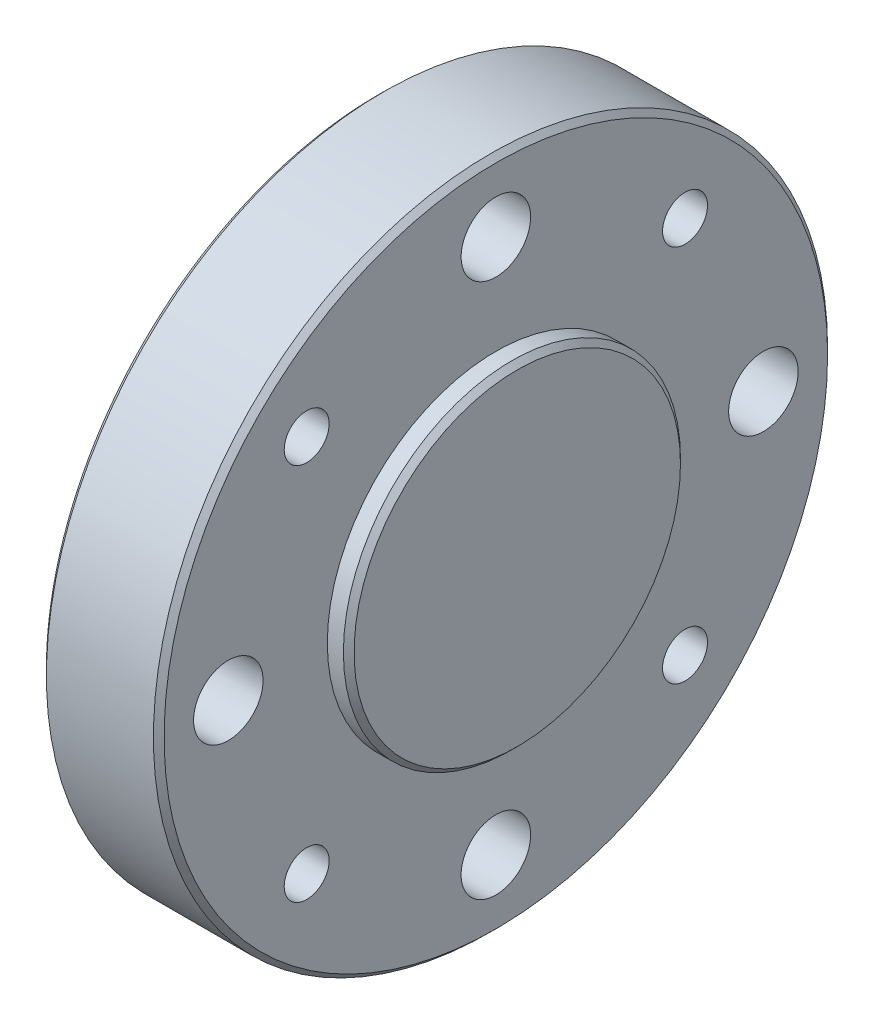
ISO-10303-21;
HEADER;
FILE_DESCRIPTION(('STEP AP214'),'2;1');
FILE_NAME('part.step','',(''),(''),'','','');
FILE_SCHEMA(('AUTOMOTIVE_DESIGN { 1 0 10303 214 1 1 1 1 }'));
ENDSEC;
DATA;
#1=APPLICATION_CONTEXT('core data for automotive mechanical design processes');
#2=APPLICATION_PROTOCOL_DEFINITION('international standard','automotive_design',2000,#1);
#3=PRODUCT_CONTEXT('',#1,'mechanical');
#4=PRODUCT('Part','Part','',(#3));
#5=PRODUCT_RELATED_PRODUCT_CATEGORY('part','',(#4));
#6=PRODUCT_DEFINITION_FORMATION('','',#4);
#7=PRODUCT_DEFINITION_CONTEXT('part definition',#1,'design');
#8=PRODUCT_DEFINITION('design','',#6,#7);
#9=PRODUCT_DEFINITION_SHAPE('','',#8);
#10=(LENGTH_UNIT() NAMED_UNIT(*) SI_UNIT(.MILLI.,.METRE.));
#11=(NAMED_UNIT(*) PLANE_ANGLE_UNIT() SI_UNIT($,.RADIAN.));
#12=(NAMED_UNIT(*) SI_UNIT($,.STERADIAN.) SOLID_ANGLE_UNIT());
#13=UNCERTAINTY_MEASURE_WITH_UNIT(LENGTH_MEASURE(1.E-05),#10,'distance_accuracy_value','');
#14=(GEOMETRIC_REPRESENTATION_CONTEXT(3) GLOBAL_UNCERTAINTY_ASSIGNED_CONTEXT((#13)) GLOBAL_UNIT_ASSIGNED_CONTEXT((#10,
#11,#12)) REPRESENTATION_CONTEXT('',''));
#15=CARTESIAN_POINT('',(0.,0.,0.));
#16=DIRECTION('',(0.,0.,1.));
#17=DIRECTION('',(1.,0.,0.));
#18=AXIS2_PLACEMENT_3D('',#15,#16,#17);
#19=CARTESIAN_POINT('',(0.,0.,0.));
#20=DIRECTION('',(1.,0.,0.));
#21=DIRECTION('',(0.,0.,-1.));
#22=AXIS2_PLACEMENT_3D('',#19,#20,#21);
#23=PLANE('',#22);
#24=CARTESIAN_POINT('',(0.,17.6776695296637,-17.6776695296637));
#25=DIRECTION('',(-1.,0.,0.));
#26=DIRECTION('',(0.,0.,1.));
#27=AXIS2_PLACEMENT_3D('',#24,#25,#26);
#28=CIRCLE('',#27,2.1);
#29=CARTESIAN_POINT('',(0.,17.6776695296637,-15.5776695296637));
#30=VERTEX_POINT('',#29);
#31=EDGE_CURVE('E456',#30,#30,#28,.T.);
#32=ORIENTED_EDGE('',*,*,#31,.F.);
#33=EDGE_LOOP('',(#32));
#34=FACE_BOUND('',#33,.T.);
#35=CARTESIAN_POINT('',(0.,17.6776695296637,17.6776695296637));
#36=DIRECTION('',(-1.,0.,0.));
#37=DIRECTION('',(0.,0.,1.));
#38=AXIS2_PLACEMENT_3D('',#35,#36,#37);
#39=CIRCLE('',#38,2.1);
#40=CARTESIAN_POINT('',(0.,17.6776695296637,19.7776695296637));
#41=VERTEX_POINT('',#40);
#42=EDGE_CURVE('E450',#41,#41,#39,.T.);
#43=ORIENTED_EDGE('',*,*,#42,.F.);
#44=EDGE_LOOP('',(#43));
#45=FACE_BOUND('',#44,.T.);
#46=CARTESIAN_POINT('',(0.,-17.6776695296637,-17.6776695296637));
#47=DIRECTION('',(-1.,0.,0.));
#48=DIRECTION('',(0.,0.,1.));
#49=AXIS2_PLACEMENT_3D('',#46,#47,#48);
#50=CIRCLE('',#49,2.1);
#51=CARTESIAN_POINT('',(0.,-17.6776695296637,-15.5776695296637));
#52=VERTEX_POINT('',#51);
#53=EDGE_CURVE('E444',#52,#52,#50,.T.);
#54=ORIENTED_EDGE('',*,*,#53,.F.);
#55=EDGE_LOOP('',(#54));
#56=FACE_BOUND('',#55,.T.);
#57=CARTESIAN_POINT('',(0.,0.,0.));
#58=DIRECTION('',(1.,0.,0.));
#59=DIRECTION('',(0.,0.,-1.));
#60=AXIS2_PLACEMENT_3D('',#57,#58,#59);
#61=CIRCLE('',#60,31.);
#62=CARTESIAN_POINT('',(0.,31.,0.));
#63=VERTEX_POINT('',#62);
#64=CARTESIAN_POINT('',(0.,1.08235921504137E-13,-31.));
#65=VERTEX_POINT('',#64);
#66=EDGE_CURVE('E79',#63,#65,#61,.F.);
#67=ORIENTED_EDGE('',*,*,#66,.T.);
#68=CARTESIAN_POINT('',(0.,0.,-25.));
#69=DIRECTION('',(-1.,0.,0.));
#70=DIRECTION('',(0.,-1.,0.));
#71=AXIS2_PLACEMENT_3D('',#68,#69,#70);
#72=CIRCLE('',#71,6.);
#73=EDGE_CURVE('E60',#65,#65,#72,.T.);
#74=ORIENTED_EDGE('',*,*,#73,.F.);
#75=CARTESIAN_POINT('',(0.,-31.,0.));
#76=VERTEX_POINT('',#75);
#77=EDGE_CURVE('E84',#65,#76,#61,.F.);
#78=ORIENTED_EDGE('',*,*,#77,.T.);
#79=CARTESIAN_POINT('',(0.,-25.,0.));
#80=DIRECTION('',(-1.,0.,0.));
#81=DIRECTION('',(0.,0.,1.));
#82=AXIS2_PLACEMENT_3D('',#79,#80,#81);
#83=CIRCLE('',#82,6.);
#84=EDGE_CURVE('E95',#76,#76,#83,.T.);
#85=ORIENTED_EDGE('',*,*,#84,.F.);
#86=CARTESIAN_POINT('',(0.,0.,0.));
#87=DIRECTION('',(1.,0.,0.));
#88=DIRECTION('',(0.,0.,-1.));
#89=AXIS2_PLACEMENT_3D('',#86,#87,#88);
#90=CIRCLE('',#89,31.);
#91=CARTESIAN_POINT('',(0.,-1.08235921504137E-13,31.));
#92=VERTEX_POINT('',#91);
#93=EDGE_CURVE('E78',#76,#92,#90,.F.);
#94=ORIENTED_EDGE('',*,*,#93,.T.);
#95=CARTESIAN_POINT('',(0.,0.,25.));
#96=DIRECTION('',(-1.,0.,0.));
#97=DIRECTION('',(0.,-1.,0.));
#98=AXIS2_PLACEMENT_3D('',#95,#96,#97);
#99=CIRCLE('',#98,6.);
#100=EDGE_CURVE('E55',#92,#92,#99,.T.);
#101=ORIENTED_EDGE('',*,*,#100,.F.);
#102=EDGE_CURVE('E69',#92,#63,#90,.F.);
#103=ORIENTED_EDGE('',*,*,#102,.T.);
#104=CARTESIAN_POINT('',(0.,25.,0.));
#105=DIRECTION('',(-1.,0.,0.));
#106=DIRECTION('',(0.,0.,1.));
#107=AXIS2_PLACEMENT_3D('',#104,#105,#106);
#108=CIRCLE('',#107,6.);
#109=EDGE_CURVE('E74',#63,#63,#108,.T.);
#110=ORIENTED_EDGE('',*,*,#109,.F.);
#111=EDGE_LOOP('',(#67,#74,#78,#85,#94,#101,#103,#110));
#112=FACE_BOUND('',#111,.T.);
#113=CARTESIAN_POINT('',(0.,-17.6776695296637,17.6776695296637));
#114=DIRECTION('',(-1.,0.,0.));
#115=DIRECTION('',(0.,0.,1.));
#116=AXIS2_PLACEMENT_3D('',#113,#114,#115);
#117=CIRCLE('',#116,2.1);
#118=CARTESIAN_POINT('',(0.,-17.6776695296637,19.7776695296637));
#119=VERTEX_POINT('',#118);
#120=EDGE_CURVE('E438',#119,#119,#117,.T.);
#121=ORIENTED_EDGE('',*,*,#120,.F.);
#122=EDGE_LOOP('',(#121));
#123=FACE_BOUND('',#122,.T.);
#124=ADVANCED_FACE('F39',(#34,#45,#56,#112,#123),#23,.F.);
#125=CARTESIAN_POINT('',(13.,0.,25.));
#126=DIRECTION('',(-1.,0.,0.));
#127=DIRECTION('',(0.,0.,1.));
#128=AXIS2_PLACEMENT_3D('',#125,#126,#127);
#129=CYLINDRICAL_SURFACE('',#128,3.25);
#130=CARTESIAN_POINT('',(11.,0.,25.));
#131=DIRECTION('',(1.,0.,0.));
#132=DIRECTION('',(0.,0.,-1.));
#133=AXIS2_PLACEMENT_3D('',#130,#131,#132);
#134=CIRCLE('',#133,3.25);
#135=CARTESIAN_POINT('',(11.,0.,28.25));
#136=VERTEX_POINT('',#135);
#137=EDGE_CURVE('E130',#136,#136,#134,.T.);
#138=CARTESIAN_POINT('',(5.,0.,25.));
#139=DIRECTION('',(-1.,0.,0.));
#140=DIRECTION('',(0.,0.,1.));
#141=AXIS2_PLACEMENT_3D('',#138,#139,#140);
#142=CIRCLE('',#141,3.25);
#143=CARTESIAN_POINT('',(5.,0.,28.25));
#144=VERTEX_POINT('',#143);
#145=EDGE_CURVE('E44',#144,#144,#142,.F.);
#146=CARTESIAN_POINT('',(11.,0.,28.25));
#147=CARTESIAN_POINT('',(10.9375,0.,28.25));
#148=CARTESIAN_POINT('',(10.875,0.,28.25));
#149=CARTESIAN_POINT('',(10.75,0.,28.25));
#150=CARTESIAN_POINT('',(10.6875,0.,28.25));
#151=CARTESIAN_POINT('',(10.5625,0.,28.25));
#152=CARTESIAN_POINT('',(10.5,0.,28.25));
#153=CARTESIAN_POINT('',(10.375,0.,28.25));
#154=CARTESIAN_POINT('',(10.3125,0.,28.25));
#155=CARTESIAN_POINT('',(10.1875,0.,28.25));
#156=CARTESIAN_POINT('',(10.125,0.,28.25));
#157=CARTESIAN_POINT('',(10.,0.,28.25));
#158=CARTESIAN_POINT('',(9.9375,0.,28.25));
#159=CARTESIAN_POINT('',(9.8125,0.,28.25));
#160=CARTESIAN_POINT('',(9.75,0.,28.25));
#161=CARTESIAN_POINT('',(9.625,0.,28.25));
#162=CARTESIAN_POINT('',(9.5625,0.,28.25));
#163=CARTESIAN_POINT('',(9.4375,0.,28.25));
#164=CARTESIAN_POINT('',(9.375,0.,28.25));
#165=CARTESIAN_POINT('',(9.25,0.,28.25));
#166=CARTESIAN_POINT('',(9.1875,0.,28.25));
#167=CARTESIAN_POINT('',(9.0625,0.,28.25));
#168=CARTESIAN_POINT('',(9.,0.,28.25));
#169=CARTESIAN_POINT('',(8.875,0.,28.25));
#170=CARTESIAN_POINT('',(8.8125,0.,28.25));
#171=CARTESIAN_POINT('',(8.6875,0.,28.25));
#172=CARTESIAN_POINT('',(8.625,0.,28.25));
#173=CARTESIAN_POINT('',(8.5,0.,28.25));
#174=CARTESIAN_POINT('',(8.4375,0.,28.25));
#175=CARTESIAN_POINT('',(8.3125,0.,28.25));
#176=CARTESIAN_POINT('',(8.25,0.,28.25));
#177=CARTESIAN_POINT('',(8.125,0.,28.25));
#178=CARTESIAN_POINT('',(8.0625,0.,28.25));
#179=CARTESIAN_POINT('',(7.9375,0.,28.25));
#180=CARTESIAN_POINT('',(7.875,0.,28.25));
#181=CARTESIAN_POINT('',(7.75,0.,28.25));
#182=CARTESIAN_POINT('',(7.6875,0.,28.25));
#183=CARTESIAN_POINT('',(7.5625,0.,28.25));
#184=CARTESIAN_POINT('',(7.5,0.,28.25));
#185=CARTESIAN_POINT('',(7.375,0.,28.25));
#186=CARTESIAN_POINT('',(7.3125,0.,28.25));
#187=CARTESIAN_POINT('',(7.1875,0.,28.25));
#188=CARTESIAN_POINT('',(7.125,0.,28.25));
#189=CARTESIAN_POINT('',(7.,0.,28.25));
#190=CARTESIAN_POINT('',(6.9375,0.,28.25));
#191=CARTESIAN_POINT('',(6.8125,0.,28.25));
#192=CARTESIAN_POINT('',(6.75,0.,28.25));
#193=CARTESIAN_POINT('',(6.625,0.,28.25));
#194=CARTESIAN_POINT('',(6.5625,0.,28.25));
#195=CARTESIAN_POINT('',(6.4375,0.,28.25));
#196=CARTESIAN_POINT('',(6.375,0.,28.25));
#197=CARTESIAN_POINT('',(6.25,0.,28.25));
#198=CARTESIAN_POINT('',(6.1875,0.,28.25));
#199=CARTESIAN_POINT('',(6.0625,0.,28.25));
#200=CARTESIAN_POINT('',(6.,0.,28.25));
#201=CARTESIAN_POINT('',(5.875,0.,28.25));
#202=CARTESIAN_POINT('',(5.8125,0.,28.25));
#203=CARTESIAN_POINT('',(5.6875,0.,28.25));
#204=CARTESIAN_POINT('',(5.625,0.,28.25));
#205=CARTESIAN_POINT('',(5.5,0.,28.25));
#206=CARTESIAN_POINT('',(5.4375,0.,28.25));
#207=CARTESIAN_POINT('',(5.3125,0.,28.25));
#208=CARTESIAN_POINT('',(5.25,0.,28.25));
#209=CARTESIAN_POINT('',(5.125,0.,28.25));
#210=CARTESIAN_POINT('',(5.0625,0.,28.25));
#211=CARTESIAN_POINT('',(5.,0.,28.25));
#212=B_SPLINE_CURVE_WITH_KNOTS('',3,(#146,#147,#148,#149,#150,#151,#152,#153,#154,#155,#156,
#157,#158,#159,#160,#161,#162,#163,#164,#165,#166,#167,#168,#169,#170,#171,#172,#173,#174,#175,
#176,#177,#178,#179,#180,#181,#182,#183,#184,#185,#186,#187,#188,#189,#190,#191,#192,#193,#194,
#195,#196,#197,#198,#199,#200,#201,#202,#203,#204,#205,#206,#207,#208,#209,#210,#211),
.UNSPECIFIED.,.F.,.F.,(4,2,2,2,2,2,2,2,2,2,2,2,2,2,2,2,2,2,2,2,2,2,2,2,2,2,2,2,2,2,2,2,4),(0.,
0.1875,0.374999999999999,0.562499999999999,0.749999999999999,0.937499999999999,1.125,1.3125,1.5,
1.6875,1.875,2.0625,2.25,2.4375,2.625,2.8125,3.,3.1875,3.375,3.5625,3.75,3.9375,4.125,4.3125,
4.5,4.6875,4.875,5.0625,5.25,5.4375,5.625,5.8125,6.),.UNSPECIFIED.);
#213=EDGE_CURVE('BSEAM184',#136,#144,#212,.T.);
#214=ORIENTED_EDGE('',*,*,#137,.T.);
#215=ORIENTED_EDGE('',*,*,#145,.F.);
#216=ORIENTED_EDGE('',*,*,#213,.T.);
#217=ORIENTED_EDGE('',*,*,#213,.F.);
#218=EDGE_LOOP('',(#214,#216,#215,#217));
#219=FACE_BOUND('',#218,.T.);
#220=ADVANCED_FACE('F184',(#219),#129,.F.);
#221=CARTESIAN_POINT('',(13.,0.,-25.));
#222=DIRECTION('',(-1.,0.,0.));
#223=DIRECTION('',(0.,0.,1.));
#224=AXIS2_PLACEMENT_3D('',#221,#222,#223);
#225=CYLINDRICAL_SURFACE('',#224,3.25);
#226=CARTESIAN_POINT('',(11.,0.,-25.));
#227=DIRECTION('',(1.,0.,0.));
#228=DIRECTION('',(0.,0.,-1.));
#229=AXIS2_PLACEMENT_3D('',#226,#227,#228);
#230=CIRCLE('',#229,3.25);
#231=CARTESIAN_POINT('',(11.,0.,-21.75));
#232=VERTEX_POINT('',#231);
#233=EDGE_CURVE('E101',#232,#232,#230,.T.);
#234=CARTESIAN_POINT('',(5.,0.,-25.));
#235=DIRECTION('',(-1.,0.,0.));
#236=DIRECTION('',(0.,0.,1.));
#237=AXIS2_PLACEMENT_3D('',#234,#235,#236);
#238=CIRCLE('',#237,3.25);
#239=CARTESIAN_POINT('',(5.,0.,-21.75));
#240=VERTEX_POINT('',#239);
#241=EDGE_CURVE('E124',#240,#240,#238,.F.);
#242=CARTESIAN_POINT('',(11.,0.,-21.75));
#243=CARTESIAN_POINT('',(10.9375,0.,-21.75));
#244=CARTESIAN_POINT('',(10.875,0.,-21.75));
#245=CARTESIAN_POINT('',(10.75,0.,-21.75));
#246=CARTESIAN_POINT('',(10.6875,0.,-21.75));
#247=CARTESIAN_POINT('',(10.5625,0.,-21.75));
#248=CARTESIAN_POINT('',(10.5,0.,-21.75));
#249=CARTESIAN_POINT('',(10.375,0.,-21.75));
#250=CARTESIAN_POINT('',(10.3125,0.,-21.75));
#251=CARTESIAN_POINT('',(10.1875,0.,-21.75));
#252=CARTESIAN_POINT('',(10.125,0.,-21.75));
#253=CARTESIAN_POINT('',(10.,0.,-21.75));
#254=CARTESIAN_POINT('',(9.9375,0.,-21.75));
#255=CARTESIAN_POINT('',(9.8125,0.,-21.75));
#256=CARTESIAN_POINT('',(9.75,0.,-21.75));
#257=CARTESIAN_POINT('',(9.625,0.,-21.75));
#258=CARTESIAN_POINT('',(9.5625,0.,-21.75));
#259=CARTESIAN_POINT('',(9.4375,0.,-21.75));
#260=CARTESIAN_POINT('',(9.375,0.,-21.75));
#261=CARTESIAN_POINT('',(9.25,0.,-21.75));
#262=CARTESIAN_POINT('',(9.1875,0.,-21.75));
#263=CARTESIAN_POINT('',(9.0625,0.,-21.75));
#264=CARTESIAN_POINT('',(9.,0.,-21.75));
#265=CARTESIAN_POINT('',(8.875,0.,-21.75));
#266=CARTESIAN_POINT('',(8.8125,0.,-21.75));
#267=CARTESIAN_POINT('',(8.6875,0.,-21.75));
#268=CARTESIAN_POINT('',(8.625,0.,-21.75));
#269=CARTESIAN_POINT('',(8.5,0.,-21.75));
#270=CARTESIAN_POINT('',(8.4375,0.,-21.75));
#271=CARTESIAN_POINT('',(8.3125,0.,-21.75));
#272=CARTESIAN_POINT('',(8.25,0.,-21.75));
#273=CARTESIAN_POINT('',(8.125,0.,-21.75));
#274=CARTESIAN_POINT('',(8.0625,0.,-21.75));
#275=CARTESIAN_POINT('',(7.9375,0.,-21.75));
#276=CARTESIAN_POINT('',(7.875,0.,-21.75));
#277=CARTESIAN_POINT('',(7.75,0.,-21.75));
#278=CARTESIAN_POINT('',(7.6875,0.,-21.75));
#279=CARTESIAN_POINT('',(7.5625,0.,-21.75));
#280=CARTESIAN_POINT('',(7.5,0.,-21.75));
#281=CARTESIAN_POINT('',(7.375,0.,-21.75));
#282=CARTESIAN_POINT('',(7.3125,0.,-21.75));
#283=CARTESIAN_POINT('',(7.1875,0.,-21.75));
#284=CARTESIAN_POINT('',(7.125,0.,-21.75));
#285=CARTESIAN_POINT('',(7.,0.,-21.75));
#286=CARTESIAN_POINT('',(6.9375,0.,-21.75));
#287=CARTESIAN_POINT('',(6.8125,0.,-21.75));
#288=CARTESIAN_POINT('',(6.75,0.,-21.75));
#289=CARTESIAN_POINT('',(6.625,0.,-21.75));
#290=CARTESIAN_POINT('',(6.5625,0.,-21.75));
#291=CARTESIAN_POINT('',(6.4375,0.,-21.75));
#292=CARTESIAN_POINT('',(6.375,0.,-21.75));
#293=CARTESIAN_POINT('',(6.25,0.,-21.75));
#294=CARTESIAN_POINT('',(6.1875,0.,-21.75));
#295=CARTESIAN_POINT('',(6.0625,0.,-21.75));
#296=CARTESIAN_POINT('',(6.,0.,-21.75));
#297=CARTESIAN_POINT('',(5.875,0.,-21.75));
#298=CARTESIAN_POINT('',(5.8125,0.,-21.75));
#299=CARTESIAN_POINT('',(5.6875,0.,-21.75));
#300=CARTESIAN_POINT('',(5.625,0.,-21.75));
#301=CARTESIAN_POINT('',(5.5,0.,-21.75));
#302=CARTESIAN_POINT('',(5.4375,0.,-21.75));
#303=CARTESIAN_POINT('',(5.3125,0.,-21.75));
#304=CARTESIAN_POINT('',(5.25,0.,-21.75));
#305=CARTESIAN_POINT('',(5.125,0.,-21.75));
#306=CARTESIAN_POINT('',(5.0625,0.,-21.75));
#307=CARTESIAN_POINT('',(5.,0.,-21.75));
#308=B_SPLINE_CURVE_WITH_KNOTS('',3,(#242,#243,#244,#245,#246,#247,#248,#249,#250,#251,#252,
#253,#254,#255,#256,#257,#258,#259,#260,#261,#262,#263,#264,#265,#266,#267,#268,#269,#270,#271,
#272,#273,#274,#275,#276,#277,#278,#279,#280,#281,#282,#283,#284,#285,#286,#287,#288,#289,#290,
#291,#292,#293,#294,#295,#296,#297,#298,#299,#300,#301,#302,#303,#304,#305,#306,#307),
.UNSPECIFIED.,.F.,.F.,(4,2,2,2,2,2,2,2,2,2,2,2,2,2,2,2,2,2,2,2,2,2,2,2,2,2,2,2,2,2,2,2,4),(0.,
0.1875,0.374999999999999,0.562499999999999,0.749999999999999,0.937499999999999,1.125,1.3125,1.5,
1.6875,1.875,2.0625,2.25,2.4375,2.625,2.8125,3.,3.1875,3.375,3.5625,3.75,3.9375,4.125,4.3125,
4.5,4.6875,4.875,5.0625,5.25,5.4375,5.625,5.8125,6.),.UNSPECIFIED.);
#309=EDGE_CURVE('BSEAM165',#232,#240,#308,.T.);
#310=ORIENTED_EDGE('',*,*,#233,.T.);
#311=ORIENTED_EDGE('',*,*,#241,.F.);
#312=ORIENTED_EDGE('',*,*,#309,.T.);
#313=ORIENTED_EDGE('',*,*,#309,.F.);
#314=EDGE_LOOP('',(#310,#312,#311,#313));
#315=FACE_BOUND('',#314,.T.);
#316=ADVANCED_FACE('F165',(#315),#225,.F.);
#317=CARTESIAN_POINT('',(11.,-25.,0.));
#318=DIRECTION('',(-1.,0.,0.));
#319=DIRECTION('',(0.,0.,1.));
#320=AXIS2_PLACEMENT_3D('',#317,#318,#319);
#321=CYLINDRICAL_SURFACE('',#320,3.25);
#322=CARTESIAN_POINT('',(11.,-25.,0.));
#323=DIRECTION('',(-1.,0.,0.));
#324=DIRECTION('',(0.,0.,1.));
#325=AXIS2_PLACEMENT_3D('',#322,#323,#324);
#326=CIRCLE('',#325,3.25);
#327=CARTESIAN_POINT('',(11.,-25.,3.25));
#328=VERTEX_POINT('',#327);
#329=EDGE_CURVE('E106',#328,#328,#326,.T.);
#330=ORIENTED_EDGE('',*,*,#329,.F.);
#331=EDGE_LOOP('',(#330));
#332=FACE_BOUND('',#331,.T.);
#333=CARTESIAN_POINT('',(5.,-25.,0.));
#334=DIRECTION('',(-1.,0.,0.));
#335=DIRECTION('',(0.,0.,1.));
#336=AXIS2_PLACEMENT_3D('',#333,#334,#335);
#337=CIRCLE('',#336,3.25);
#338=CARTESIAN_POINT('',(5.,-25.,3.25));
#339=VERTEX_POINT('',#338);
#340=EDGE_CURVE('E109',#339,#339,#337,.F.);
#341=ORIENTED_EDGE('',*,*,#340,.F.);
#342=EDGE_LOOP('',(#341));
#343=FACE_BOUND('',#342,.T.);
#344=ADVANCED_FACE('F161',(#332,#343),#321,.F.);
#345=CARTESIAN_POINT('',(11.,25.,0.));
#346=DIRECTION('',(-1.,0.,0.));
#347=DIRECTION('',(0.,0.,1.));
#348=AXIS2_PLACEMENT_3D('',#345,#346,#347);
#349=CYLINDRICAL_SURFACE('',#348,3.25);
#350=CARTESIAN_POINT('',(11.,25.,0.));
#351=DIRECTION('',(-1.,0.,0.));
#352=DIRECTION('',(0.,0.,1.));
#353=AXIS2_PLACEMENT_3D('',#350,#351,#352);
#354=CIRCLE('',#353,3.25);
#355=CARTESIAN_POINT('',(11.,25.,3.25));
#356=VERTEX_POINT('',#355);
#357=EDGE_CURVE('E102',#356,#356,#354,.T.);
#358=ORIENTED_EDGE('',*,*,#357,.F.);
#359=EDGE_LOOP('',(#358));
#360=FACE_BOUND('',#359,.T.);
#361=CARTESIAN_POINT('',(5.,25.,0.));
#362=DIRECTION('',(-1.,0.,0.));
#363=DIRECTION('',(0.,0.,1.));
#364=AXIS2_PLACEMENT_3D('',#361,#362,#363);
#365=CIRCLE('',#364,3.25);
#366=CARTESIAN_POINT('',(5.,25.,3.25));
#367=VERTEX_POINT('',#366);
#368=EDGE_CURVE('E92',#367,#367,#365,.F.);
#369=ORIENTED_EDGE('',*,*,#368,.F.);
#370=EDGE_LOOP('',(#369));
#371=FACE_BOUND('',#370,.T.);
#372=ADVANCED_FACE('F164',(#360,#371),#349,.F.);
#373=CARTESIAN_POINT('',(11.,0.,0.));
#374=DIRECTION('',(-1.,0.,0.));
#375=DIRECTION('',(0.,0.,1.));
#376=AXIS2_PLACEMENT_3D('',#373,#374,#375);
#377=CYLINDRICAL_SURFACE('',#376,31.5);
#378=CARTESIAN_POINT('',(10.5,0.,0.));
#379=DIRECTION('',(1.,0.,0.));
#380=DIRECTION('',(0.,0.,-1.));
#381=AXIS2_PLACEMENT_3D('',#378,#379,#380);
#382=CIRCLE('',#381,31.5);
#383=CARTESIAN_POINT('',(10.5,0.,-31.5));
#384=VERTEX_POINT('',#383);
#385=EDGE_CURVE('E119',#384,#384,#382,.F.);
#386=ORIENTED_EDGE('',*,*,#385,.T.);
#387=EDGE_LOOP('',(#386));
#388=FACE_BOUND('',#387,.T.);
#389=CARTESIAN_POINT('',(0.499999999999994,0.,0.));
#390=DIRECTION('',(1.,0.,0.));
#391=DIRECTION('',(0.,0.,-1.));
#392=AXIS2_PLACEMENT_3D('',#389,#390,#391);
#393=CIRCLE('',#392,31.5);
#394=CARTESIAN_POINT('',(0.499999999999994,0.,-31.5));
#395=VERTEX_POINT('',#394);
#396=EDGE_CURVE('E116',#395,#395,#393,.T.);
#397=ORIENTED_EDGE('',*,*,#396,.T.);
#398=EDGE_LOOP('',(#397));
#399=FACE_BOUND('',#398,.T.);
#400=ADVANCED_FACE('F152',(#388,#399),#377,.T.);
#401=CARTESIAN_POINT('',(11.,0.,0.));
#402=DIRECTION('',(1.,0.,0.));
#403=DIRECTION('',(0.,0.,-1.));
#404=AXIS2_PLACEMENT_3D('',#401,#402,#403);
#405=PLANE('',#404);
#406=CARTESIAN_POINT('',(11.,17.6776695296637,-17.6776695296637));
#407=DIRECTION('',(1.,0.,0.));
#408=DIRECTION('',(0.,0.,-1.));
#409=AXIS2_PLACEMENT_3D('',#406,#407,#408);
#410=CIRCLE('',#409,2.1);
#411=CARTESIAN_POINT('',(11.,17.6776695296637,-19.7776695296637));
#412=VERTEX_POINT('',#411);
#413=EDGE_CURVE('E453',#412,#412,#410,.T.);
#414=ORIENTED_EDGE('',*,*,#413,.F.);
#415=EDGE_LOOP('',(#414));
#416=FACE_BOUND('',#415,.T.);
#417=CARTESIAN_POINT('',(11.,17.6776695296637,17.6776695296637));
#418=DIRECTION('',(1.,0.,0.));
#419=DIRECTION('',(0.,0.,-1.));
#420=AXIS2_PLACEMENT_3D('',#417,#418,#419);
#421=CIRCLE('',#420,2.1);
#422=CARTESIAN_POINT('',(11.,17.6776695296637,15.5776695296637));
#423=VERTEX_POINT('',#422);
#424=EDGE_CURVE('E447',#423,#423,#421,.T.);
#425=ORIENTED_EDGE('',*,*,#424,.F.);
#426=EDGE_LOOP('',(#425));
#427=FACE_BOUND('',#426,.T.);
#428=CARTESIAN_POINT('',(11.,-17.6776695296637,-17.6776695296637));
#429=DIRECTION('',(1.,0.,0.));
#430=DIRECTION('',(0.,0.,-1.));
#431=AXIS2_PLACEMENT_3D('',#428,#429,#430);
#432=CIRCLE('',#431,2.1);
#433=CARTESIAN_POINT('',(11.,-17.6776695296637,-19.7776695296637));
#434=VERTEX_POINT('',#433);
#435=EDGE_CURVE('E441',#434,#434,#432,.T.);
#436=ORIENTED_EDGE('',*,*,#435,.F.);
#437=EDGE_LOOP('',(#436));
#438=FACE_BOUND('',#437,.T.);
#439=CARTESIAN_POINT('',(11.,-17.6776695296637,17.6776695296637));
#440=DIRECTION('',(1.,0.,0.));
#441=DIRECTION('',(0.,0.,-1.));
#442=AXIS2_PLACEMENT_3D('',#439,#440,#441);
#443=CIRCLE('',#442,2.1);
#444=CARTESIAN_POINT('',(11.,-17.6776695296637,15.5776695296637));
#445=VERTEX_POINT('',#444);
#446=EDGE_CURVE('E434',#445,#445,#443,.T.);
#447=ORIENTED_EDGE('',*,*,#446,.F.);
#448=EDGE_LOOP('',(#447));
#449=FACE_BOUND('',#448,.T.);
#450=ORIENTED_EDGE('',*,*,#233,.F.);
#451=EDGE_LOOP('',(#450));
#452=FACE_BOUND('',#451,.T.);
#453=ORIENTED_EDGE('',*,*,#137,.F.);
#454=EDGE_LOOP('',(#453));
#455=FACE_BOUND('',#454,.T.);
#456=CARTESIAN_POINT('',(11.,0.,0.));
#457=DIRECTION('',(1.,0.,0.));
#458=DIRECTION('',(0.,0.,-1.));
#459=AXIS2_PLACEMENT_3D('',#456,#457,#458);
#460=CIRCLE('',#459,15.75);
#461=CARTESIAN_POINT('',(11.,0.,-15.75));
#462=VERTEX_POINT('',#461);
#463=EDGE_CURVE('E122',#462,#462,#460,.T.);
#464=ORIENTED_EDGE('',*,*,#463,.F.);
#465=EDGE_LOOP('',(#464));
#466=FACE_BOUND('',#465,.T.);
#467=CARTESIAN_POINT('',(11.,0.,0.));
#468=DIRECTION('',(1.,0.,0.));
#469=DIRECTION('',(0.,0.,-1.));
#470=AXIS2_PLACEMENT_3D('',#467,#468,#469);
#471=CIRCLE('',#470,31.);
#472=CARTESIAN_POINT('',(11.,0.,-31.));
#473=VERTEX_POINT('',#472);
#474=EDGE_CURVE('E105',#473,#473,#471,.T.);
#475=ORIENTED_EDGE('',*,*,#474,.T.);
#476=EDGE_LOOP('',(#475));
#477=FACE_BOUND('',#476,.T.);
#478=ORIENTED_EDGE('',*,*,#357,.T.);
#479=EDGE_LOOP('',(#478));
#480=FACE_BOUND('',#479,.T.);
#481=ORIENTED_EDGE('',*,*,#329,.T.);
#482=EDGE_LOOP('',(#481));
#483=FACE_BOUND('',#482,.T.);
#484=ADVANCED_FACE('F148',(#416,#427,#438,#449,#452,#455,#466,#477,#480,#483),#405,.T.);
#485=CARTESIAN_POINT('',(5.,25.,0.));
#486=DIRECTION('',(-1.,0.,0.));
#487=DIRECTION('',(0.,0.,1.));
#488=AXIS2_PLACEMENT_3D('',#485,#486,#487);
#489=PLANE('',#488);
#490=CARTESIAN_POINT('',(5.,25.,0.));
#491=DIRECTION('',(-1.,0.,0.));
#492=DIRECTION('',(0.,0.,1.));
#493=AXIS2_PLACEMENT_3D('',#490,#491,#492);
#494=CIRCLE('',#493,6.);
#495=CARTESIAN_POINT('',(5.,25.,6.));
#496=VERTEX_POINT('',#495);
#497=EDGE_CURVE('E88',#496,#496,#494,.T.);
#498=ORIENTED_EDGE('',*,*,#497,.T.);
#499=EDGE_LOOP('',(#498));
#500=FACE_BOUND('',#499,.T.);
#501=ORIENTED_EDGE('',*,*,#368,.T.);
#502=EDGE_LOOP('',(#501));
#503=FACE_BOUND('',#502,.T.);
#504=ADVANCED_FACE('F151',(#500,#503),#489,.T.);
#505=CARTESIAN_POINT('',(5.,25.,0.));
#506=DIRECTION('',(-1.,0.,0.));
#507=DIRECTION('',(0.,0.,1.));
#508=AXIS2_PLACEMENT_3D('',#505,#506,#507);
#509=CYLINDRICAL_SURFACE('',#508,6.);
#510=ORIENTED_EDGE('',*,*,#497,.F.);
#511=EDGE_LOOP('',(#510));
#512=FACE_BOUND('',#511,.T.);
#513=ORIENTED_EDGE('',*,*,#109,.T.);
#514=EDGE_LOOP('',(#513));
#515=FACE_BOUND('',#514,.T.);
#516=ADVANCED_FACE('F87',(#512,#515),#509,.F.);
#517=CARTESIAN_POINT('',(5.,-25.,0.));
#518=DIRECTION('',(-1.,0.,0.));
#519=DIRECTION('',(0.,0.,1.));
#520=AXIS2_PLACEMENT_3D('',#517,#518,#519);
#521=PLANE('',#520);
#522=CARTESIAN_POINT('',(5.,-25.,0.));
#523=DIRECTION('',(-1.,0.,0.));
#524=DIRECTION('',(0.,0.,1.));
#525=AXIS2_PLACEMENT_3D('',#522,#523,#524);
#526=CIRCLE('',#525,6.);
#527=CARTESIAN_POINT('',(5.,-25.,6.));
#528=VERTEX_POINT('',#527);
#529=EDGE_CURVE('E89',#528,#528,#526,.T.);
#530=ORIENTED_EDGE('',*,*,#529,.T.);
#531=EDGE_LOOP('',(#530));
#532=FACE_BOUND('',#531,.T.);
#533=ORIENTED_EDGE('',*,*,#340,.T.);
#534=EDGE_LOOP('',(#533));
#535=FACE_BOUND('',#534,.T.);
#536=ADVANCED_FACE('F169',(#532,#535),#521,.T.);
#537=CARTESIAN_POINT('',(5.,-25.,0.));
#538=DIRECTION('',(-1.,0.,0.));
#539=DIRECTION('',(0.,0.,1.));
#540=AXIS2_PLACEMENT_3D('',#537,#538,#539);
#541=CYLINDRICAL_SURFACE('',#540,6.);
#542=ORIENTED_EDGE('',*,*,#529,.F.);
#543=EDGE_LOOP('',(#542));
#544=FACE_BOUND('',#543,.T.);
#545=ORIENTED_EDGE('',*,*,#84,.T.);
#546=EDGE_LOOP('',(#545));
#547=FACE_BOUND('',#546,.T.);
#548=ADVANCED_FACE('F171',(#544,#547),#541,.F.);
#549=CARTESIAN_POINT('',(11.,0.,0.));
#550=DIRECTION('',(-1.,0.,0.));
#551=DIRECTION('',(0.,0.,1.));
#552=AXIS2_PLACEMENT_3D('',#549,#550,#551);
#553=CONICAL_SURFACE('',#552,31.,0.785398163397448);
#554=ORIENTED_EDGE('',*,*,#385,.F.);
#555=EDGE_LOOP('',(#554));
#556=FACE_BOUND('',#555,.T.);
#557=ORIENTED_EDGE('',*,*,#474,.F.);
#558=EDGE_LOOP('',(#557));
#559=FACE_BOUND('',#558,.T.);
#560=ADVANCED_FACE('F178',(#556,#559),#553,.T.);
#561=CARTESIAN_POINT('',(0.499999999999994,0.,0.));
#562=DIRECTION('',(1.,0.,0.));
#563=DIRECTION('',(0.,0.,-1.));
#564=AXIS2_PLACEMENT_3D('',#561,#562,#563);
#565=CONICAL_SURFACE('',#564,31.5,0.785398163397448);
#566=ORIENTED_EDGE('',*,*,#66,.F.);
#567=ORIENTED_EDGE('',*,*,#102,.F.);
#568=ORIENTED_EDGE('',*,*,#93,.F.);
#569=ORIENTED_EDGE('',*,*,#77,.F.);
#570=EDGE_LOOP('',(#566,#567,#568,#569));
#571=FACE_BOUND('',#570,.T.);
#572=ORIENTED_EDGE('',*,*,#396,.F.);
#573=EDGE_LOOP('',(#572));
#574=FACE_BOUND('',#573,.T.);
#575=ADVANCED_FACE('F82',(#571,#574),#565,.T.);
#576=CARTESIAN_POINT('',(13.,0.,0.));
#577=DIRECTION('',(-1.,0.,0.));
#578=DIRECTION('',(0.,0.,1.));
#579=AXIS2_PLACEMENT_3D('',#576,#577,#578);
#580=CYLINDRICAL_SURFACE('',#579,15.75);
#581=CARTESIAN_POINT('',(12.5,0.,0.));
#582=DIRECTION('',(1.,0.,0.));
#583=DIRECTION('',(0.,0.,-1.));
#584=AXIS2_PLACEMENT_3D('',#581,#582,#583);
#585=CIRCLE('',#584,15.75);
#586=CARTESIAN_POINT('',(12.5,0.,-15.75));
#587=VERTEX_POINT('',#586);
#588=EDGE_CURVE('E11',#587,#587,#585,.F.);
#589=ORIENTED_EDGE('',*,*,#588,.T.);
#590=EDGE_LOOP('',(#589));
#591=FACE_BOUND('',#590,.T.);
#592=ORIENTED_EDGE('',*,*,#463,.T.);
#593=EDGE_LOOP('',(#592));
#594=FACE_BOUND('',#593,.T.);
#595=ADVANCED_FACE('F146',(#591,#594),#580,.T.);
#596=CARTESIAN_POINT('',(13.,0.,0.));
#597=DIRECTION('',(1.,0.,0.));
#598=DIRECTION('',(0.,0.,-1.));
#599=AXIS2_PLACEMENT_3D('',#596,#597,#598);
#600=PLANE('',#599);
#601=CARTESIAN_POINT('',(13.,0.,0.));
#602=DIRECTION('',(1.,0.,0.));
#603=DIRECTION('',(0.,0.,-1.));
#604=AXIS2_PLACEMENT_3D('',#601,#602,#603);
#605=CIRCLE('',#604,15.25);
#606=CARTESIAN_POINT('',(13.,0.,-15.25));
#607=VERTEX_POINT('',#606);
#608=EDGE_CURVE('E49',#607,#607,#605,.T.);
#609=ORIENTED_EDGE('',*,*,#608,.T.);
#610=EDGE_LOOP('',(#609));
#611=FACE_BOUND('',#610,.T.);
#612=ADVANCED_FACE('F210',(#611),#600,.T.);
#613=CARTESIAN_POINT('',(13.,0.,0.));
#614=DIRECTION('',(-1.,0.,0.));
#615=DIRECTION('',(0.,0.,1.));
#616=AXIS2_PLACEMENT_3D('',#613,#614,#615);
#617=CONICAL_SURFACE('',#616,15.25,0.785398163397452);
#618=ORIENTED_EDGE('',*,*,#588,.F.);
#619=EDGE_LOOP('',(#618));
#620=FACE_BOUND('',#619,.T.);
#621=ORIENTED_EDGE('',*,*,#608,.F.);
#622=EDGE_LOOP('',(#621));
#623=FACE_BOUND('',#622,.T.);
#624=ADVANCED_FACE('F42',(#620,#623),#617,.T.);
#625=CARTESIAN_POINT('',(5.,0.,-25.));
#626=DIRECTION('',(-1.,0.,0.));
#627=DIRECTION('',(0.,-1.,0.));
#628=AXIS2_PLACEMENT_3D('',#625,#626,#627);
#629=PLANE('',#628);
#630=CARTESIAN_POINT('',(5.,0.,-25.));
#631=DIRECTION('',(-1.,0.,0.));
#632=DIRECTION('',(0.,-1.,0.));
#633=AXIS2_PLACEMENT_3D('',#630,#631,#632);
#634=CIRCLE('',#633,6.);
#635=CARTESIAN_POINT('',(5.,-5.99999999999991,-25.));
#636=VERTEX_POINT('',#635);
#637=EDGE_CURVE('E135',#636,#636,#634,.T.);
#638=ORIENTED_EDGE('',*,*,#637,.T.);
#639=EDGE_LOOP('',(#638));
#640=FACE_BOUND('',#639,.T.);
#641=ORIENTED_EDGE('',*,*,#241,.T.);
#642=EDGE_LOOP('',(#641));
#643=FACE_BOUND('',#642,.T.);
#644=ADVANCED_FACE('F333',(#640,#643),#629,.T.);
#645=CARTESIAN_POINT('',(5.,0.,-25.));
#646=DIRECTION('',(-1.,0.,0.));
#647=DIRECTION('',(0.,0.,1.));
#648=AXIS2_PLACEMENT_3D('',#645,#646,#647);
#649=CYLINDRICAL_SURFACE('',#648,6.);
#650=ORIENTED_EDGE('',*,*,#637,.F.);
#651=EDGE_LOOP('',(#650));
#652=FACE_BOUND('',#651,.T.);
#653=ORIENTED_EDGE('',*,*,#73,.T.);
#654=EDGE_LOOP('',(#653));
#655=FACE_BOUND('',#654,.T.);
#656=ADVANCED_FACE('F326',(#652,#655),#649,.F.);
#657=CARTESIAN_POINT('',(5.,0.,25.));
#658=DIRECTION('',(-1.,0.,0.));
#659=DIRECTION('',(0.,-1.,0.));
#660=AXIS2_PLACEMENT_3D('',#657,#658,#659);
#661=PLANE('',#660);
#662=CARTESIAN_POINT('',(5.,0.,25.));
#663=DIRECTION('',(-1.,0.,0.));
#664=DIRECTION('',(0.,-1.,0.));
#665=AXIS2_PLACEMENT_3D('',#662,#663,#664);
#666=CIRCLE('',#665,6.);
#667=CARTESIAN_POINT('',(5.,-6.00000000000009,25.));
#668=VERTEX_POINT('',#667);
#669=EDGE_CURVE('E126',#668,#668,#666,.T.);
#670=ORIENTED_EDGE('',*,*,#669,.T.);
#671=EDGE_LOOP('',(#670));
#672=FACE_BOUND('',#671,.T.);
#673=ORIENTED_EDGE('',*,*,#145,.T.);
#674=EDGE_LOOP('',(#673));
#675=FACE_BOUND('',#674,.T.);
#676=ADVANCED_FACE('F318',(#672,#675),#661,.T.);
#677=CARTESIAN_POINT('',(5.,0.,25.));
#678=DIRECTION('',(-1.,0.,0.));
#679=DIRECTION('',(0.,0.,1.));
#680=AXIS2_PLACEMENT_3D('',#677,#678,#679);
#681=CYLINDRICAL_SURFACE('',#680,6.);
#682=ORIENTED_EDGE('',*,*,#669,.F.);
#683=EDGE_LOOP('',(#682));
#684=FACE_BOUND('',#683,.T.);
#685=ORIENTED_EDGE('',*,*,#100,.T.);
#686=EDGE_LOOP('',(#685));
#687=FACE_BOUND('',#686,.T.);
#688=ADVANCED_FACE('F261',(#684,#687),#681,.F.);
#689=CARTESIAN_POINT('',(0.,-17.6776695296637,17.6776695296637));
#690=DIRECTION('',(-1.,0.,0.));
#691=DIRECTION('',(0.,0.,1.));
#692=AXIS2_PLACEMENT_3D('',#689,#690,#691);
#693=CYLINDRICAL_SURFACE('',#692,2.1);
#694=ORIENTED_EDGE('',*,*,#446,.T.);
#695=EDGE_LOOP('',(#694));
#696=FACE_BOUND('',#695,.T.);
#697=ORIENTED_EDGE('',*,*,#120,.T.);
#698=EDGE_LOOP('',(#697));
#699=FACE_BOUND('',#698,.T.);
#700=ADVANCED_FACE('F254',(#696,#699),#693,.F.);
#701=CARTESIAN_POINT('',(0.,-17.6776695296637,-17.6776695296637));
#702=DIRECTION('',(-1.,0.,0.));
#703=DIRECTION('',(0.,0.,1.));
#704=AXIS2_PLACEMENT_3D('',#701,#702,#703);
#705=CYLINDRICAL_SURFACE('',#704,2.1);
#706=ORIENTED_EDGE('',*,*,#435,.T.);
#707=EDGE_LOOP('',(#706));
#708=FACE_BOUND('',#707,.T.);
#709=ORIENTED_EDGE('',*,*,#53,.T.);
#710=EDGE_LOOP('',(#709));
#711=FACE_BOUND('',#710,.T.);
#712=ADVANCED_FACE('F260',(#708,#711),#705,.F.);
#713=CARTESIAN_POINT('',(0.,17.6776695296637,17.6776695296637));
#714=DIRECTION('',(-1.,0.,0.));
#715=DIRECTION('',(0.,0.,1.));
#716=AXIS2_PLACEMENT_3D('',#713,#714,#715);
#717=CYLINDRICAL_SURFACE('',#716,2.1);
#718=ORIENTED_EDGE('',*,*,#424,.T.);
#719=EDGE_LOOP('',(#718));
#720=FACE_BOUND('',#719,.T.);
#721=ORIENTED_EDGE('',*,*,#42,.T.);
#722=EDGE_LOOP('',(#721));
#723=FACE_BOUND('',#722,.T.);
#724=ADVANCED_FACE('F273',(#720,#723),#717,.F.);
#725=CARTESIAN_POINT('',(0.,17.6776695296637,-17.6776695296637));
#726=DIRECTION('',(-1.,0.,0.));
#727=DIRECTION('',(0.,0.,1.));
#728=AXIS2_PLACEMENT_3D('',#725,#726,#727);
#729=CYLINDRICAL_SURFACE('',#728,2.1);
#730=ORIENTED_EDGE('',*,*,#413,.T.);
#731=EDGE_LOOP('',(#730));
#732=FACE_BOUND('',#731,.T.);
#733=ORIENTED_EDGE('',*,*,#31,.T.);
#734=EDGE_LOOP('',(#733));
#735=FACE_BOUND('',#734,.T.);
#736=ADVANCED_FACE('F285',(#732,#735),#729,.F.);
#737=CLOSED_SHELL('',(#124,#220,#316,#344,#372,#400,#484,#504,#516,#536,#548,#560,#575,#595,
#612,#624,#644,#656,#676,#688,#700,#712,#724,#736));
#738=MANIFOLD_SOLID_BREP('B2',#737);
#739=ADVANCED_BREP_SHAPE_REPRESENTATION('',(#18,#738),#14);
#740=SHAPE_DEFINITION_REPRESENTATION(#9,#739);
ENDSEC;
END-ISO-10303-21;
